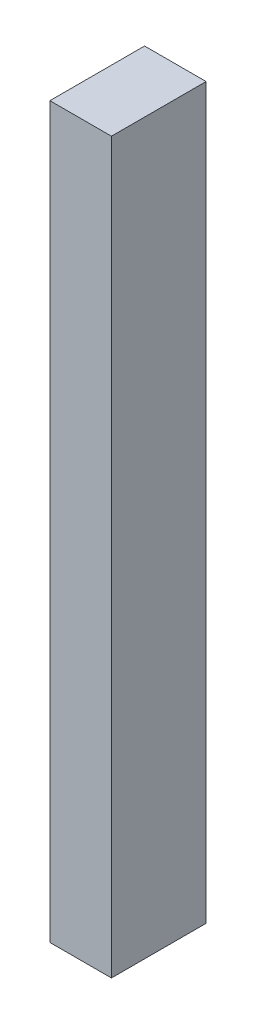
ISO-10303-21;
HEADER;
FILE_DESCRIPTION(('STEP AP214'),'2;1');
FILE_NAME('part.step','',(''),(''),'','','');
FILE_SCHEMA(('AUTOMOTIVE_DESIGN { 1 0 10303 214 1 1 1 1 }'));
ENDSEC;
DATA;
#1=APPLICATION_CONTEXT('core data for automotive mechanical design processes');
#2=APPLICATION_PROTOCOL_DEFINITION('international standard','automotive_design',2000,#1);
#3=PRODUCT_CONTEXT('',#1,'mechanical');
#4=PRODUCT('Part','Part','',(#3));
#5=PRODUCT_RELATED_PRODUCT_CATEGORY('part','',(#4));
#6=PRODUCT_DEFINITION_FORMATION('','',#4);
#7=PRODUCT_DEFINITION_CONTEXT('part definition',#1,'design');
#8=PRODUCT_DEFINITION('design','',#6,#7);
#9=PRODUCT_DEFINITION_SHAPE('','',#8);
#10=(LENGTH_UNIT() NAMED_UNIT(*) SI_UNIT(.MILLI.,.METRE.));
#11=(NAMED_UNIT(*) PLANE_ANGLE_UNIT() SI_UNIT($,.RADIAN.));
#12=(NAMED_UNIT(*) SI_UNIT($,.STERADIAN.) SOLID_ANGLE_UNIT());
#13=UNCERTAINTY_MEASURE_WITH_UNIT(LENGTH_MEASURE(1.E-05),#10,'distance_accuracy_value','');
#14=(GEOMETRIC_REPRESENTATION_CONTEXT(3) GLOBAL_UNCERTAINTY_ASSIGNED_CONTEXT((#13)) GLOBAL_UNIT_ASSIGNED_CONTEXT((#10,
#11,#12)) REPRESENTATION_CONTEXT('',''));
#15=CARTESIAN_POINT('',(0.,0.,0.));
#16=DIRECTION('',(0.,0.,1.));
#17=DIRECTION('',(1.,0.,0.));
#18=AXIS2_PLACEMENT_3D('',#15,#16,#17);
#19=CARTESIAN_POINT('',(-3.25,77.,-5.));
#20=DIRECTION('',(1.,0.,0.));
#21=DIRECTION('',(0.,0.,-1.));
#22=AXIS2_PLACEMENT_3D('',#19,#20,#21);
#23=PLANE('',#22);
#24=DIRECTION('',(0.,0.,1.));
#25=VECTOR('',#24,1.);
#26=CARTESIAN_POINT('',(-3.25,0.,-5.));
#27=LINE('',#26,#25);
#28=CARTESIAN_POINT('',(-3.25,0.,-5.));
#29=VERTEX_POINT('',#28);
#30=CARTESIAN_POINT('',(-3.25,0.,5.));
#31=VERTEX_POINT('',#30);
#32=EDGE_CURVE('E113',#29,#31,#27,.T.);
#33=ORIENTED_EDGE('',*,*,#32,.T.);
#34=DIRECTION('',(0.,-1.,0.));
#35=VECTOR('',#34,1.);
#36=CARTESIAN_POINT('',(-3.25,77.,5.));
#37=LINE('',#36,#35);
#38=CARTESIAN_POINT('',(-3.25,77.,5.));
#39=VERTEX_POINT('',#38);
#40=EDGE_CURVE('E11',#39,#31,#37,.T.);
#41=ORIENTED_EDGE('',*,*,#40,.F.);
#42=DIRECTION('',(0.,0.,1.));
#43=VECTOR('',#42,1.);
#44=CARTESIAN_POINT('',(-3.25,77.,-5.));
#45=LINE('',#44,#43);
#46=CARTESIAN_POINT('',(-3.25,77.,-5.));
#47=VERTEX_POINT('',#46);
#48=EDGE_CURVE('E97',#47,#39,#45,.T.);
#49=ORIENTED_EDGE('',*,*,#48,.F.);
#50=DIRECTION('',(0.,-1.,0.));
#51=VECTOR('',#50,1.);
#52=CARTESIAN_POINT('',(-3.25,77.,-5.));
#53=LINE('',#52,#51);
#54=EDGE_CURVE('E109',#47,#29,#53,.T.);
#55=ORIENTED_EDGE('',*,*,#54,.T.);
#56=EDGE_LOOP('',(#33,#41,#49,#55));
#57=FACE_BOUND('',#56,.T.);
#58=ADVANCED_FACE('F45',(#57),#23,.F.);
#59=CARTESIAN_POINT('',(3.25,77.,5.));
#60=DIRECTION('',(0.,0.,-1.));
#61=DIRECTION('',(-1.,0.,0.));
#62=AXIS2_PLACEMENT_3D('',#59,#60,#61);
#63=PLANE('',#62);
#64=DIRECTION('',(1.,0.,0.));
#65=VECTOR('',#64,1.);
#66=CARTESIAN_POINT('',(3.25,0.,5.));
#67=LINE('',#66,#65);
#68=CARTESIAN_POINT('',(3.25,0.,5.));
#69=VERTEX_POINT('',#68);
#70=EDGE_CURVE('E102',#31,#69,#67,.T.);
#71=ORIENTED_EDGE('',*,*,#70,.T.);
#72=DIRECTION('',(0.,-1.,0.));
#73=VECTOR('',#72,1.);
#74=CARTESIAN_POINT('',(3.25,77.,5.));
#75=LINE('',#74,#73);
#76=CARTESIAN_POINT('',(3.25,77.,5.));
#77=VERTEX_POINT('',#76);
#78=EDGE_CURVE('E54',#77,#69,#75,.T.);
#79=ORIENTED_EDGE('',*,*,#78,.F.);
#80=DIRECTION('',(1.,0.,0.));
#81=VECTOR('',#80,1.);
#82=CARTESIAN_POINT('',(3.25,77.,5.));
#83=LINE('',#82,#81);
#84=EDGE_CURVE('E92',#39,#77,#83,.T.);
#85=ORIENTED_EDGE('',*,*,#84,.F.);
#86=ORIENTED_EDGE('',*,*,#40,.T.);
#87=EDGE_LOOP('',(#71,#79,#85,#86));
#88=FACE_BOUND('',#87,.T.);
#89=ADVANCED_FACE('F101',(#88),#63,.F.);
#90=CARTESIAN_POINT('',(3.25,77.,-5.));
#91=DIRECTION('',(-1.,0.,0.));
#92=DIRECTION('',(0.,0.,1.));
#93=AXIS2_PLACEMENT_3D('',#90,#91,#92);
#94=PLANE('',#93);
#95=DIRECTION('',(0.,0.,-1.));
#96=VECTOR('',#95,1.);
#97=CARTESIAN_POINT('',(3.25,0.,-5.));
#98=LINE('',#97,#96);
#99=CARTESIAN_POINT('',(3.25,0.,-5.));
#100=VERTEX_POINT('',#99);
#101=EDGE_CURVE('E79',#69,#100,#98,.T.);
#102=ORIENTED_EDGE('',*,*,#101,.T.);
#103=DIRECTION('',(0.,-1.,0.));
#104=VECTOR('',#103,1.);
#105=CARTESIAN_POINT('',(3.25,77.,-5.));
#106=LINE('',#105,#104);
#107=CARTESIAN_POINT('',(3.25,77.,-5.));
#108=VERTEX_POINT('',#107);
#109=EDGE_CURVE('E104',#108,#100,#106,.T.);
#110=ORIENTED_EDGE('',*,*,#109,.F.);
#111=DIRECTION('',(0.,0.,-1.));
#112=VECTOR('',#111,1.);
#113=CARTESIAN_POINT('',(3.25,77.,-5.));
#114=LINE('',#113,#112);
#115=EDGE_CURVE('E95',#77,#108,#114,.T.);
#116=ORIENTED_EDGE('',*,*,#115,.F.);
#117=ORIENTED_EDGE('',*,*,#78,.T.);
#118=EDGE_LOOP('',(#102,#110,#116,#117));
#119=FACE_BOUND('',#118,.T.);
#120=ADVANCED_FACE('F105',(#119),#94,.F.);
#121=CARTESIAN_POINT('',(3.25,77.,-5.));
#122=DIRECTION('',(0.,0.,1.));
#123=DIRECTION('',(1.,0.,0.));
#124=AXIS2_PLACEMENT_3D('',#121,#122,#123);
#125=PLANE('',#124);
#126=DIRECTION('',(-1.,0.,0.));
#127=VECTOR('',#126,1.);
#128=CARTESIAN_POINT('',(3.25,0.,-5.));
#129=LINE('',#128,#127);
#130=EDGE_CURVE('E85',#100,#29,#129,.T.);
#131=ORIENTED_EDGE('',*,*,#130,.T.);
#132=ORIENTED_EDGE('',*,*,#54,.F.);
#133=DIRECTION('',(-1.,0.,0.));
#134=VECTOR('',#133,1.);
#135=CARTESIAN_POINT('',(3.25,77.,-5.));
#136=LINE('',#135,#134);
#137=EDGE_CURVE('E62',#108,#47,#136,.T.);
#138=ORIENTED_EDGE('',*,*,#137,.F.);
#139=ORIENTED_EDGE('',*,*,#109,.T.);
#140=EDGE_LOOP('',(#131,#132,#138,#139));
#141=FACE_BOUND('',#140,.T.);
#142=ADVANCED_FACE('F126',(#141),#125,.F.);
#143=CARTESIAN_POINT('',(0.,77.,0.));
#144=DIRECTION('',(0.,-1.,0.));
#145=DIRECTION('',(0.,0.,-1.));
#146=AXIS2_PLACEMENT_3D('',#143,#144,#145);
#147=PLANE('',#146);
#148=ORIENTED_EDGE('',*,*,#48,.T.);
#149=ORIENTED_EDGE('',*,*,#84,.T.);
#150=ORIENTED_EDGE('',*,*,#115,.T.);
#151=ORIENTED_EDGE('',*,*,#137,.T.);
#152=EDGE_LOOP('',(#148,#149,#150,#151));
#153=FACE_BOUND('',#152,.T.);
#154=ADVANCED_FACE('F93',(#153),#147,.F.);
#155=CARTESIAN_POINT('',(0.,0.,0.));
#156=DIRECTION('',(0.,-1.,0.));
#157=DIRECTION('',(0.,0.,-1.));
#158=AXIS2_PLACEMENT_3D('',#155,#156,#157);
#159=PLANE('',#158);
#160=ORIENTED_EDGE('',*,*,#32,.F.);
#161=ORIENTED_EDGE('',*,*,#130,.F.);
#162=ORIENTED_EDGE('',*,*,#101,.F.);
#163=ORIENTED_EDGE('',*,*,#70,.F.);
#164=EDGE_LOOP('',(#160,#161,#162,#163));
#165=FACE_BOUND('',#164,.T.);
#166=ADVANCED_FACE('F129',(#165),#159,.T.);
#167=CLOSED_SHELL('',(#58,#89,#120,#142,#154,#166));
#168=MANIFOLD_SOLID_BREP('B2',#167);
#169=ADVANCED_BREP_SHAPE_REPRESENTATION('',(#18,#168),#14);
#170=SHAPE_DEFINITION_REPRESENTATION(#9,#169);
ENDSEC;
END-ISO-10303-21;
